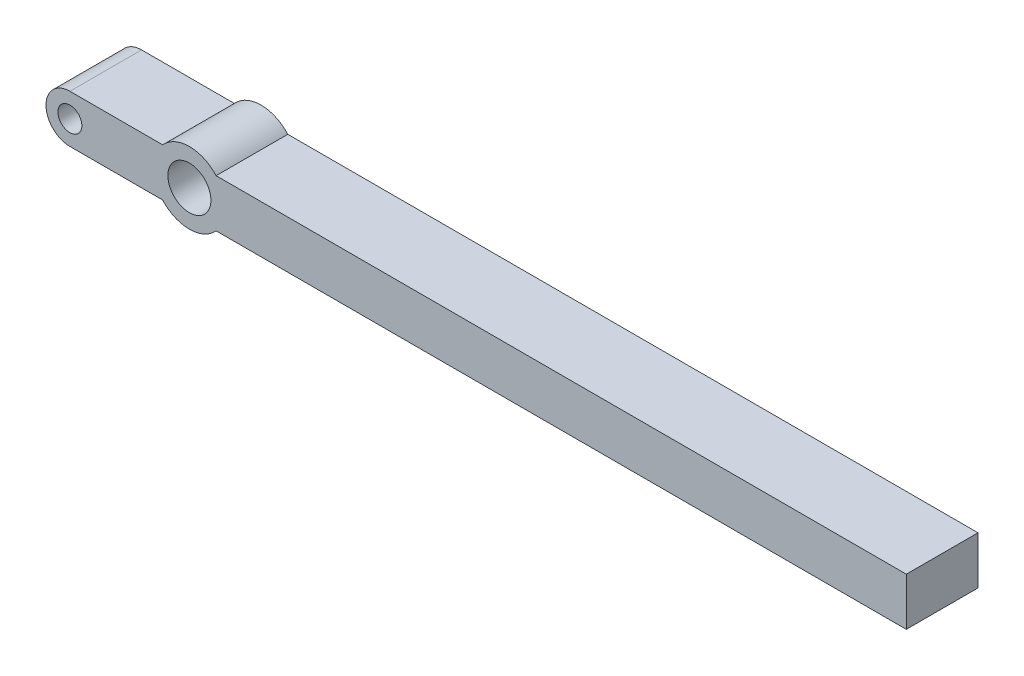
ISO-10303-21;
HEADER;
FILE_DESCRIPTION(('STEP AP214'),'2;1');
FILE_NAME('part.step','',(''),(''),'','','');
FILE_SCHEMA(('AUTOMOTIVE_DESIGN { 1 0 10303 214 1 1 1 1 }'));
ENDSEC;
DATA;
#1=APPLICATION_CONTEXT('core data for automotive mechanical design processes');
#2=APPLICATION_PROTOCOL_DEFINITION('international standard','automotive_design',2000,#1);
#3=PRODUCT_CONTEXT('',#1,'mechanical');
#4=PRODUCT('Part','Part','',(#3));
#5=PRODUCT_RELATED_PRODUCT_CATEGORY('part','',(#4));
#6=PRODUCT_DEFINITION_FORMATION('','',#4);
#7=PRODUCT_DEFINITION_CONTEXT('part definition',#1,'design');
#8=PRODUCT_DEFINITION('design','',#6,#7);
#9=PRODUCT_DEFINITION_SHAPE('','',#8);
#10=(LENGTH_UNIT() NAMED_UNIT(*) SI_UNIT(.MILLI.,.METRE.));
#11=(NAMED_UNIT(*) PLANE_ANGLE_UNIT() SI_UNIT($,.RADIAN.));
#12=(NAMED_UNIT(*) SI_UNIT($,.STERADIAN.) SOLID_ANGLE_UNIT());
#13=UNCERTAINTY_MEASURE_WITH_UNIT(LENGTH_MEASURE(1.E-05),#10,'distance_accuracy_value','');
#14=(GEOMETRIC_REPRESENTATION_CONTEXT(3) GLOBAL_UNCERTAINTY_ASSIGNED_CONTEXT((#13)) GLOBAL_UNIT_ASSIGNED_CONTEXT((#10,
#11,#12)) REPRESENTATION_CONTEXT('',''));
#15=CARTESIAN_POINT('',(0.,0.,0.));
#16=DIRECTION('',(0.,0.,1.));
#17=DIRECTION('',(1.,0.,0.));
#18=AXIS2_PLACEMENT_3D('',#15,#16,#17);
#19=CARTESIAN_POINT('',(0.,33.780487804878,-15.));
#20=DIRECTION('',(0.,-1.,0.));
#21=DIRECTION('',(1.,0.,0.));
#22=AXIS2_PLACEMENT_3D('',#19,#20,#21);
#23=PLANE('',#22);
#24=DIRECTION('',(0.,0.,1.));
#25=VECTOR('',#24,1.);
#26=CARTESIAN_POINT('',(-6.62453816128155,33.780487804878,-15.));
#27=LINE('',#26,#25);
#28=CARTESIAN_POINT('',(-6.62453816128155,33.780487804878,-15.));
#29=VERTEX_POINT('',#28);
#30=CARTESIAN_POINT('',(-6.62453816128155,33.780487804878,15.));
#31=VERTEX_POINT('',#30);
#32=EDGE_CURVE('E42',#29,#31,#27,.T.);
#33=ORIENTED_EDGE('',*,*,#32,.T.);
#34=DIRECTION('',(1.,0.,0.));
#35=VECTOR('',#34,1.);
#36=CARTESIAN_POINT('',(0.,33.780487804878,15.));
#37=LINE('',#36,#35);
#38=CARTESIAN_POINT('',(282.19512195122,33.780487804878,15.));
#39=VERTEX_POINT('',#38);
#40=EDGE_CURVE('E105',#31,#39,#37,.T.);
#41=ORIENTED_EDGE('',*,*,#40,.T.);
#42=DIRECTION('',(0.,0.,1.));
#43=VECTOR('',#42,1.);
#44=CARTESIAN_POINT('',(282.19512195122,33.780487804878,-15.));
#45=LINE('',#44,#43);
#46=CARTESIAN_POINT('',(282.19512195122,33.780487804878,-15.));
#47=VERTEX_POINT('',#46);
#48=EDGE_CURVE('E11',#47,#39,#45,.T.);
#49=ORIENTED_EDGE('',*,*,#48,.F.);
#50=DIRECTION('',(1.,0.,0.));
#51=VECTOR('',#50,1.);
#52=CARTESIAN_POINT('',(0.,33.780487804878,-15.));
#53=LINE('',#52,#51);
#54=EDGE_CURVE('E107',#29,#47,#53,.T.);
#55=ORIENTED_EDGE('',*,*,#54,.F.);
#56=EDGE_LOOP('',(#33,#41,#49,#55));
#57=FACE_BOUND('',#56,.T.);
#58=ADVANCED_FACE('F39',(#57),#23,.F.);
#59=CARTESIAN_POINT('',(282.19512195122,0.,-15.));
#60=DIRECTION('',(-1.,0.,0.));
#61=DIRECTION('',(0.,0.,1.));
#62=AXIS2_PLACEMENT_3D('',#59,#60,#61);
#63=PLANE('',#62);
#64=ORIENTED_EDGE('',*,*,#48,.T.);
#65=DIRECTION('',(0.,-1.,0.));
#66=VECTOR('',#65,1.);
#67=CARTESIAN_POINT('',(282.19512195122,0.,15.));
#68=LINE('',#67,#66);
#69=CARTESIAN_POINT('',(282.19512195122,13.780487804878,15.));
#70=VERTEX_POINT('',#69);
#71=EDGE_CURVE('E127',#39,#70,#68,.T.);
#72=ORIENTED_EDGE('',*,*,#71,.T.);
#73=DIRECTION('',(0.,0.,1.));
#74=VECTOR('',#73,1.);
#75=CARTESIAN_POINT('',(282.19512195122,13.780487804878,-15.));
#76=LINE('',#75,#74);
#77=CARTESIAN_POINT('',(282.19512195122,13.780487804878,-15.));
#78=VERTEX_POINT('',#77);
#79=EDGE_CURVE('E47',#78,#70,#76,.T.);
#80=ORIENTED_EDGE('',*,*,#79,.F.);
#81=DIRECTION('',(0.,-1.,0.));
#82=VECTOR('',#81,1.);
#83=CARTESIAN_POINT('',(282.19512195122,0.,-15.));
#84=LINE('',#83,#82);
#85=EDGE_CURVE('E54',#47,#78,#84,.T.);
#86=ORIENTED_EDGE('',*,*,#85,.F.);
#87=EDGE_LOOP('',(#64,#72,#80,#86));
#88=FACE_BOUND('',#87,.T.);
#89=ADVANCED_FACE('F197',(#88),#63,.F.);
#90=CARTESIAN_POINT('',(0.,13.780487804878,-15.));
#91=DIRECTION('',(0.,-1.,0.));
#92=DIRECTION('',(1.,0.,0.));
#93=AXIS2_PLACEMENT_3D('',#90,#91,#92);
#94=PLANE('',#93);
#95=ORIENTED_EDGE('',*,*,#79,.T.);
#96=DIRECTION('',(1.,0.,0.));
#97=VECTOR('',#96,1.);
#98=CARTESIAN_POINT('',(0.,13.780487804878,15.));
#99=LINE('',#98,#97);
#100=CARTESIAN_POINT('',(-6.62453816128155,13.780487804878,15.));
#101=VERTEX_POINT('',#100);
#102=EDGE_CURVE('E137',#101,#70,#99,.T.);
#103=ORIENTED_EDGE('',*,*,#102,.F.);
#104=DIRECTION('',(0.,0.,1.));
#105=VECTOR('',#104,1.);
#106=CARTESIAN_POINT('',(-6.62453816128155,13.780487804878,-15.));
#107=LINE('',#106,#105);
#108=CARTESIAN_POINT('',(-6.62453816128155,13.780487804878,-15.));
#109=VERTEX_POINT('',#108);
#110=EDGE_CURVE('E168',#109,#101,#107,.T.);
#111=ORIENTED_EDGE('',*,*,#110,.F.);
#112=DIRECTION('',(1.,0.,0.));
#113=VECTOR('',#112,1.);
#114=CARTESIAN_POINT('',(0.,13.780487804878,-15.));
#115=LINE('',#114,#113);
#116=EDGE_CURVE('E158',#109,#78,#115,.T.);
#117=ORIENTED_EDGE('',*,*,#116,.T.);
#118=EDGE_LOOP('',(#95,#103,#111,#117));
#119=FACE_BOUND('',#118,.T.);
#120=ADVANCED_FACE('F195',(#119),#94,.T.);
#121=CARTESIAN_POINT('',(-17.8048780487805,23.780487804878,-15.));
#122=DIRECTION('',(0.,0.,1.));
#123=DIRECTION('',(1.,0.,0.));
#124=AXIS2_PLACEMENT_3D('',#121,#122,#123);
#125=CYLINDRICAL_SURFACE('',#124,15.);
#126=ORIENTED_EDGE('',*,*,#110,.T.);
#127=CARTESIAN_POINT('',(-17.8048780487805,23.780487804878,15.));
#128=DIRECTION('',(0.,0.,1.));
#129=DIRECTION('',(1.,0.,0.));
#130=AXIS2_PLACEMENT_3D('',#127,#128,#129);
#131=CIRCLE('',#130,15.);
#132=CARTESIAN_POINT('',(-28.9852179362794,13.780487804878,15.));
#133=VERTEX_POINT('',#132);
#134=EDGE_CURVE('E122',#133,#101,#131,.T.);
#135=ORIENTED_EDGE('',*,*,#134,.F.);
#136=DIRECTION('',(0.,0.,1.));
#137=VECTOR('',#136,1.);
#138=CARTESIAN_POINT('',(-28.9852179362794,13.780487804878,-15.));
#139=LINE('',#138,#137);
#140=CARTESIAN_POINT('',(-28.9852179362794,13.780487804878,-15.));
#141=VERTEX_POINT('',#140);
#142=EDGE_CURVE('E170',#141,#133,#139,.T.);
#143=ORIENTED_EDGE('',*,*,#142,.F.);
#144=CARTESIAN_POINT('',(-17.8048780487805,23.780487804878,-15.));
#145=DIRECTION('',(0.,0.,1.));
#146=DIRECTION('',(1.,0.,0.));
#147=AXIS2_PLACEMENT_3D('',#144,#145,#146);
#148=CIRCLE('',#147,15.);
#149=EDGE_CURVE('E150',#141,#109,#148,.T.);
#150=ORIENTED_EDGE('',*,*,#149,.T.);
#151=EDGE_LOOP('',(#126,#135,#143,#150));
#152=FACE_BOUND('',#151,.T.);
#153=ADVANCED_FACE('F191',(#152),#125,.T.);
#154=CARTESIAN_POINT('',(0.,13.780487804878,-15.));
#155=DIRECTION('',(0.,-1.,0.));
#156=DIRECTION('',(1.,0.,0.));
#157=AXIS2_PLACEMENT_3D('',#154,#155,#156);
#158=PLANE('',#157);
#159=ORIENTED_EDGE('',*,*,#142,.T.);
#160=DIRECTION('',(1.,0.,0.));
#161=VECTOR('',#160,1.);
#162=CARTESIAN_POINT('',(0.,13.780487804878,15.));
#163=LINE('',#162,#161);
#164=CARTESIAN_POINT('',(-67.8048780487805,13.780487804878,15.));
#165=VERTEX_POINT('',#164);
#166=EDGE_CURVE('E134',#165,#133,#163,.T.);
#167=ORIENTED_EDGE('',*,*,#166,.F.);
#168=DIRECTION('',(0.,0.,1.));
#169=VECTOR('',#168,1.);
#170=CARTESIAN_POINT('',(-67.8048780487805,13.780487804878,-15.));
#171=LINE('',#170,#169);
#172=CARTESIAN_POINT('',(-67.8048780487805,13.780487804878,-15.));
#173=VERTEX_POINT('',#172);
#174=EDGE_CURVE('E172',#173,#165,#171,.T.);
#175=ORIENTED_EDGE('',*,*,#174,.F.);
#176=DIRECTION('',(1.,0.,0.));
#177=VECTOR('',#176,1.);
#178=CARTESIAN_POINT('',(0.,13.780487804878,-15.));
#179=LINE('',#178,#177);
#180=EDGE_CURVE('E155',#173,#141,#179,.T.);
#181=ORIENTED_EDGE('',*,*,#180,.T.);
#182=EDGE_LOOP('',(#159,#167,#175,#181));
#183=FACE_BOUND('',#182,.T.);
#184=ADVANCED_FACE('F186',(#183),#158,.T.);
#185=CARTESIAN_POINT('',(-67.8048780487805,23.780487804878,-15.));
#186=DIRECTION('',(0.,0.,1.));
#187=DIRECTION('',(1.,0.,0.));
#188=AXIS2_PLACEMENT_3D('',#185,#186,#187);
#189=CYLINDRICAL_SURFACE('',#188,10.);
#190=ORIENTED_EDGE('',*,*,#174,.T.);
#191=CARTESIAN_POINT('',(-67.8048780487805,23.780487804878,15.));
#192=DIRECTION('',(0.,0.,1.));
#193=DIRECTION('',(1.,0.,0.));
#194=AXIS2_PLACEMENT_3D('',#191,#192,#193);
#195=CIRCLE('',#194,10.);
#196=CARTESIAN_POINT('',(-67.8048780487805,33.780487804878,15.));
#197=VERTEX_POINT('',#196);
#198=EDGE_CURVE('E131',#197,#165,#195,.T.);
#199=ORIENTED_EDGE('',*,*,#198,.F.);
#200=DIRECTION('',(0.,0.,1.));
#201=VECTOR('',#200,1.);
#202=CARTESIAN_POINT('',(-67.8048780487805,33.780487804878,-15.));
#203=LINE('',#202,#201);
#204=CARTESIAN_POINT('',(-67.8048780487805,33.780487804878,-15.));
#205=VERTEX_POINT('',#204);
#206=EDGE_CURVE('E174',#205,#197,#203,.T.);
#207=ORIENTED_EDGE('',*,*,#206,.F.);
#208=CARTESIAN_POINT('',(-67.8048780487805,23.780487804878,-15.));
#209=DIRECTION('',(0.,0.,1.));
#210=DIRECTION('',(1.,0.,0.));
#211=AXIS2_PLACEMENT_3D('',#208,#209,#210);
#212=CIRCLE('',#211,10.);
#213=EDGE_CURVE('E152',#205,#173,#212,.T.);
#214=ORIENTED_EDGE('',*,*,#213,.T.);
#215=EDGE_LOOP('',(#190,#199,#207,#214));
#216=FACE_BOUND('',#215,.T.);
#217=ADVANCED_FACE('F181',(#216),#189,.T.);
#218=CARTESIAN_POINT('',(0.,33.7804878048781,-15.));
#219=DIRECTION('',(0.,-1.,0.));
#220=DIRECTION('',(1.,0.,0.));
#221=AXIS2_PLACEMENT_3D('',#218,#219,#220);
#222=PLANE('',#221);
#223=ORIENTED_EDGE('',*,*,#206,.T.);
#224=DIRECTION('',(1.,0.,0.));
#225=VECTOR('',#224,1.);
#226=CARTESIAN_POINT('',(0.,33.7804878048781,15.));
#227=LINE('',#226,#225);
#228=CARTESIAN_POINT('',(-28.9852179362794,33.780487804878,15.));
#229=VERTEX_POINT('',#228);
#230=EDGE_CURVE('E120',#197,#229,#227,.T.);
#231=ORIENTED_EDGE('',*,*,#230,.T.);
#232=DIRECTION('',(0.,0.,1.));
#233=VECTOR('',#232,1.);
#234=CARTESIAN_POINT('',(-28.9852179362794,33.780487804878,-15.));
#235=LINE('',#234,#233);
#236=CARTESIAN_POINT('',(-28.9852179362794,33.780487804878,-15.));
#237=VERTEX_POINT('',#236);
#238=EDGE_CURVE('E111',#237,#229,#235,.T.);
#239=ORIENTED_EDGE('',*,*,#238,.F.);
#240=DIRECTION('',(1.,0.,0.));
#241=VECTOR('',#240,1.);
#242=CARTESIAN_POINT('',(0.,33.7804878048781,-15.));
#243=LINE('',#242,#241);
#244=EDGE_CURVE('E149',#205,#237,#243,.T.);
#245=ORIENTED_EDGE('',*,*,#244,.F.);
#246=EDGE_LOOP('',(#223,#231,#239,#245));
#247=FACE_BOUND('',#246,.T.);
#248=ADVANCED_FACE('F178',(#247),#222,.F.);
#249=CARTESIAN_POINT('',(-17.8048780487805,23.780487804878,-15.));
#250=DIRECTION('',(0.,0.,1.));
#251=DIRECTION('',(1.,0.,0.));
#252=AXIS2_PLACEMENT_3D('',#249,#250,#251);
#253=CYLINDRICAL_SURFACE('',#252,9.);
#254=CARTESIAN_POINT('',(-17.8048780487805,23.780487804878,-15.));
#255=DIRECTION('',(0.,0.,1.));
#256=DIRECTION('',(1.,0.,0.));
#257=AXIS2_PLACEMENT_3D('',#254,#255,#256);
#258=CIRCLE('',#257,9.);
#259=CARTESIAN_POINT('',(-8.80487804878049,23.780487804878,-15.));
#260=VERTEX_POINT('',#259);
#261=EDGE_CURVE('E162',#260,#260,#258,.T.);
#262=ORIENTED_EDGE('',*,*,#261,.F.);
#263=EDGE_LOOP('',(#262));
#264=FACE_BOUND('',#263,.T.);
#265=CARTESIAN_POINT('',(-17.8048780487805,23.780487804878,15.));
#266=DIRECTION('',(0.,0.,1.));
#267=DIRECTION('',(1.,0.,0.));
#268=AXIS2_PLACEMENT_3D('',#265,#266,#267);
#269=CIRCLE('',#268,9.);
#270=CARTESIAN_POINT('',(-8.80487804878049,23.780487804878,15.));
#271=VERTEX_POINT('',#270);
#272=EDGE_CURVE('E140',#271,#271,#269,.T.);
#273=ORIENTED_EDGE('',*,*,#272,.T.);
#274=EDGE_LOOP('',(#273));
#275=FACE_BOUND('',#274,.T.);
#276=ADVANCED_FACE('F206',(#264,#275),#253,.F.);
#277=ORIENTED_EDGE('',*,*,#238,.T.);
#278=EDGE_CURVE('E114',#31,#229,#131,.T.);
#279=ORIENTED_EDGE('',*,*,#278,.F.);
#280=ORIENTED_EDGE('',*,*,#32,.F.);
#281=EDGE_CURVE('E147',#29,#237,#148,.T.);
#282=ORIENTED_EDGE('',*,*,#281,.T.);
#283=EDGE_LOOP('',(#277,#279,#280,#282));
#284=FACE_BOUND('',#283,.T.);
#285=ADVANCED_FACE('F115',(#284),#125,.T.);
#286=CARTESIAN_POINT('',(-67.8048780487805,23.780487804878,-15.));
#287=DIRECTION('',(0.,0.,1.));
#288=DIRECTION('',(1.,0.,0.));
#289=AXIS2_PLACEMENT_3D('',#286,#287,#288);
#290=CYLINDRICAL_SURFACE('',#289,5.);
#291=CARTESIAN_POINT('',(-67.8048780487805,23.780487804878,-15.));
#292=DIRECTION('',(0.,0.,1.));
#293=DIRECTION('',(1.,0.,0.));
#294=AXIS2_PLACEMENT_3D('',#291,#292,#293);
#295=CIRCLE('',#294,5.);
#296=CARTESIAN_POINT('',(-62.8048780487805,23.780487804878,-15.));
#297=VERTEX_POINT('',#296);
#298=EDGE_CURVE('E112',#297,#297,#295,.T.);
#299=ORIENTED_EDGE('',*,*,#298,.F.);
#300=EDGE_LOOP('',(#299));
#301=FACE_BOUND('',#300,.T.);
#302=CARTESIAN_POINT('',(-67.8048780487805,23.780487804878,15.));
#303=DIRECTION('',(0.,0.,1.));
#304=DIRECTION('',(1.,0.,0.));
#305=AXIS2_PLACEMENT_3D('',#302,#303,#304);
#306=CIRCLE('',#305,5.);
#307=CARTESIAN_POINT('',(-62.8048780487805,23.780487804878,15.));
#308=VERTEX_POINT('',#307);
#309=EDGE_CURVE('E143',#308,#308,#306,.T.);
#310=ORIENTED_EDGE('',*,*,#309,.T.);
#311=EDGE_LOOP('',(#310));
#312=FACE_BOUND('',#311,.T.);
#313=ADVANCED_FACE('F222',(#301,#312),#290,.F.);
#314=CARTESIAN_POINT('',(0.,0.,-15.));
#315=DIRECTION('',(0.,0.,1.));
#316=DIRECTION('',(1.,0.,0.));
#317=AXIS2_PLACEMENT_3D('',#314,#315,#316);
#318=PLANE('',#317);
#319=ORIENTED_EDGE('',*,*,#54,.T.);
#320=ORIENTED_EDGE('',*,*,#85,.T.);
#321=ORIENTED_EDGE('',*,*,#116,.F.);
#322=ORIENTED_EDGE('',*,*,#149,.F.);
#323=ORIENTED_EDGE('',*,*,#180,.F.);
#324=ORIENTED_EDGE('',*,*,#213,.F.);
#325=ORIENTED_EDGE('',*,*,#244,.T.);
#326=ORIENTED_EDGE('',*,*,#281,.F.);
#327=EDGE_LOOP('',(#319,#320,#321,#322,#323,#324,#325,#326));
#328=FACE_BOUND('',#327,.T.);
#329=ORIENTED_EDGE('',*,*,#261,.T.);
#330=EDGE_LOOP('',(#329));
#331=FACE_BOUND('',#330,.T.);
#332=ORIENTED_EDGE('',*,*,#298,.T.);
#333=EDGE_LOOP('',(#332));
#334=FACE_BOUND('',#333,.T.);
#335=ADVANCED_FACE('F192',(#328,#331,#334),#318,.F.);
#336=CARTESIAN_POINT('',(0.,0.,15.));
#337=DIRECTION('',(0.,0.,1.));
#338=DIRECTION('',(1.,0.,0.));
#339=AXIS2_PLACEMENT_3D('',#336,#337,#338);
#340=PLANE('',#339);
#341=ORIENTED_EDGE('',*,*,#40,.F.);
#342=ORIENTED_EDGE('',*,*,#278,.T.);
#343=ORIENTED_EDGE('',*,*,#230,.F.);
#344=ORIENTED_EDGE('',*,*,#198,.T.);
#345=ORIENTED_EDGE('',*,*,#166,.T.);
#346=ORIENTED_EDGE('',*,*,#134,.T.);
#347=ORIENTED_EDGE('',*,*,#102,.T.);
#348=ORIENTED_EDGE('',*,*,#71,.F.);
#349=EDGE_LOOP('',(#341,#342,#343,#344,#345,#346,#347,#348));
#350=FACE_BOUND('',#349,.T.);
#351=ORIENTED_EDGE('',*,*,#272,.F.);
#352=EDGE_LOOP('',(#351));
#353=FACE_BOUND('',#352,.T.);
#354=ORIENTED_EDGE('',*,*,#309,.F.);
#355=EDGE_LOOP('',(#354));
#356=FACE_BOUND('',#355,.T.);
#357=ADVANCED_FACE('F123',(#350,#353,#356),#340,.T.);
#358=CLOSED_SHELL('',(#58,#89,#120,#153,#184,#217,#248,#276,#285,#313,#335,#357));
#359=MANIFOLD_SOLID_BREP('B2',#358);
#360=ADVANCED_BREP_SHAPE_REPRESENTATION('',(#18,#359),#14);
#361=SHAPE_DEFINITION_REPRESENTATION(#9,#360);
ENDSEC;
END-ISO-10303-21;
